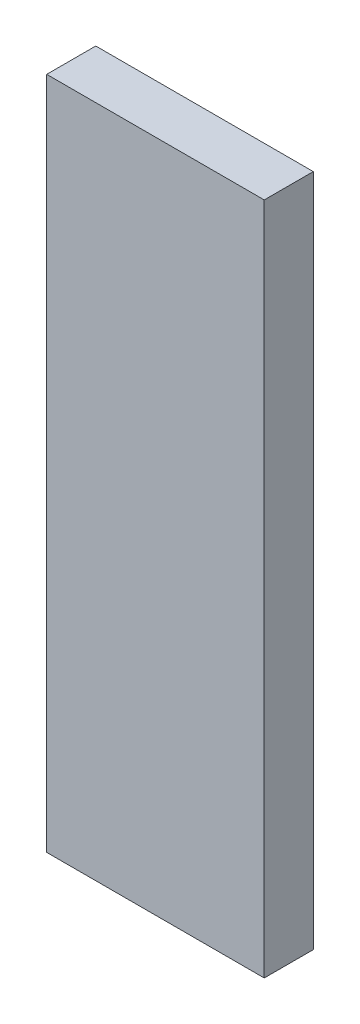
ISO-10303-21;
HEADER;
FILE_DESCRIPTION(('STEP AP214'),'2;1');
FILE_NAME('part.step','',(''),(''),'','','');
FILE_SCHEMA(('AUTOMOTIVE_DESIGN { 1 0 10303 214 1 1 1 1 }'));
ENDSEC;
DATA;
#1=APPLICATION_CONTEXT('core data for automotive mechanical design processes');
#2=APPLICATION_PROTOCOL_DEFINITION('international standard','automotive_design',2000,#1);
#3=PRODUCT_CONTEXT('',#1,'mechanical');
#4=PRODUCT('Part','Part','',(#3));
#5=PRODUCT_RELATED_PRODUCT_CATEGORY('part','',(#4));
#6=PRODUCT_DEFINITION_FORMATION('','',#4);
#7=PRODUCT_DEFINITION_CONTEXT('part definition',#1,'design');
#8=PRODUCT_DEFINITION('design','',#6,#7);
#9=PRODUCT_DEFINITION_SHAPE('','',#8);
#10=(LENGTH_UNIT() NAMED_UNIT(*) SI_UNIT(.MILLI.,.METRE.));
#11=(NAMED_UNIT(*) PLANE_ANGLE_UNIT() SI_UNIT($,.RADIAN.));
#12=(NAMED_UNIT(*) SI_UNIT($,.STERADIAN.) SOLID_ANGLE_UNIT());
#13=UNCERTAINTY_MEASURE_WITH_UNIT(LENGTH_MEASURE(1.E-05),#10,'distance_accuracy_value','');
#14=(GEOMETRIC_REPRESENTATION_CONTEXT(3) GLOBAL_UNCERTAINTY_ASSIGNED_CONTEXT((#13)) GLOBAL_UNIT_ASSIGNED_CONTEXT((#10,
#11,#12)) REPRESENTATION_CONTEXT('',''));
#15=CARTESIAN_POINT('',(0.,0.,0.));
#16=DIRECTION('',(0.,0.,1.));
#17=DIRECTION('',(1.,0.,0.));
#18=AXIS2_PLACEMENT_3D('',#15,#16,#17);
#19=CARTESIAN_POINT('',(-66.5,-206.,30.));
#20=DIRECTION('',(1.,0.,0.));
#21=DIRECTION('',(0.,0.,-1.));
#22=AXIS2_PLACEMENT_3D('',#19,#20,#21);
#23=PLANE('',#22);
#24=DIRECTION('',(0.,-1.,0.));
#25=VECTOR('',#24,1.);
#26=CARTESIAN_POINT('',(-66.5,-206.,0.));
#27=LINE('',#26,#25);
#28=CARTESIAN_POINT('',(-66.5,206.,0.));
#29=VERTEX_POINT('',#28);
#30=CARTESIAN_POINT('',(-66.5,-206.,0.));
#31=VERTEX_POINT('',#30);
#32=EDGE_CURVE('E98',#29,#31,#27,.T.);
#33=ORIENTED_EDGE('',*,*,#32,.T.);
#34=DIRECTION('',(0.,0.,-1.));
#35=VECTOR('',#34,1.);
#36=CARTESIAN_POINT('',(-66.5,-206.,30.));
#37=LINE('',#36,#35);
#38=CARTESIAN_POINT('',(-66.5,-206.,30.));
#39=VERTEX_POINT('',#38);
#40=EDGE_CURVE('E11',#39,#31,#37,.T.);
#41=ORIENTED_EDGE('',*,*,#40,.F.);
#42=DIRECTION('',(0.,-1.,0.));
#43=VECTOR('',#42,1.);
#44=CARTESIAN_POINT('',(-66.5,-206.,30.));
#45=LINE('',#44,#43);
#46=CARTESIAN_POINT('',(-66.5,206.,30.));
#47=VERTEX_POINT('',#46);
#48=EDGE_CURVE('E86',#47,#39,#45,.T.);
#49=ORIENTED_EDGE('',*,*,#48,.F.);
#50=DIRECTION('',(0.,0.,-1.));
#51=VECTOR('',#50,1.);
#52=CARTESIAN_POINT('',(-66.5,206.,30.));
#53=LINE('',#52,#51);
#54=EDGE_CURVE('E94',#47,#29,#53,.T.);
#55=ORIENTED_EDGE('',*,*,#54,.T.);
#56=EDGE_LOOP('',(#33,#41,#49,#55));
#57=FACE_BOUND('',#56,.T.);
#58=ADVANCED_FACE('F35',(#57),#23,.F.);
#59=CARTESIAN_POINT('',(66.5,-206.,30.));
#60=DIRECTION('',(0.,1.,0.));
#61=DIRECTION('',(0.,0.,1.));
#62=AXIS2_PLACEMENT_3D('',#59,#60,#61);
#63=PLANE('',#62);
#64=DIRECTION('',(1.,0.,0.));
#65=VECTOR('',#64,1.);
#66=CARTESIAN_POINT('',(66.5,-206.,0.));
#67=LINE('',#66,#65);
#68=CARTESIAN_POINT('',(66.5,-206.,0.));
#69=VERTEX_POINT('',#68);
#70=EDGE_CURVE('E90',#31,#69,#67,.T.);
#71=ORIENTED_EDGE('',*,*,#70,.T.);
#72=DIRECTION('',(0.,0.,-1.));
#73=VECTOR('',#72,1.);
#74=CARTESIAN_POINT('',(66.5,-206.,30.));
#75=LINE('',#74,#73);
#76=CARTESIAN_POINT('',(66.5,-206.,30.));
#77=VERTEX_POINT('',#76);
#78=EDGE_CURVE('E43',#77,#69,#75,.T.);
#79=ORIENTED_EDGE('',*,*,#78,.F.);
#80=DIRECTION('',(1.,0.,0.));
#81=VECTOR('',#80,1.);
#82=CARTESIAN_POINT('',(66.5,-206.,30.));
#83=LINE('',#82,#81);
#84=EDGE_CURVE('E81',#39,#77,#83,.T.);
#85=ORIENTED_EDGE('',*,*,#84,.F.);
#86=ORIENTED_EDGE('',*,*,#40,.T.);
#87=EDGE_LOOP('',(#71,#79,#85,#86));
#88=FACE_BOUND('',#87,.T.);
#89=ADVANCED_FACE('F89',(#88),#63,.F.);
#90=CARTESIAN_POINT('',(66.5,-206.,30.));
#91=DIRECTION('',(-1.,0.,0.));
#92=DIRECTION('',(0.,0.,1.));
#93=AXIS2_PLACEMENT_3D('',#90,#91,#92);
#94=PLANE('',#93);
#95=DIRECTION('',(0.,1.,0.));
#96=VECTOR('',#95,1.);
#97=CARTESIAN_POINT('',(66.5,-206.,0.));
#98=LINE('',#97,#96);
#99=CARTESIAN_POINT('',(66.5,206.,0.));
#100=VERTEX_POINT('',#99);
#101=EDGE_CURVE('E68',#69,#100,#98,.T.);
#102=ORIENTED_EDGE('',*,*,#101,.T.);
#103=DIRECTION('',(0.,0.,-1.));
#104=VECTOR('',#103,1.);
#105=CARTESIAN_POINT('',(66.5,206.,30.));
#106=LINE('',#105,#104);
#107=CARTESIAN_POINT('',(66.5,206.,30.));
#108=VERTEX_POINT('',#107);
#109=EDGE_CURVE('E91',#108,#100,#106,.T.);
#110=ORIENTED_EDGE('',*,*,#109,.F.);
#111=DIRECTION('',(0.,1.,0.));
#112=VECTOR('',#111,1.);
#113=CARTESIAN_POINT('',(66.5,-206.,30.));
#114=LINE('',#113,#112);
#115=EDGE_CURVE('E84',#77,#108,#114,.T.);
#116=ORIENTED_EDGE('',*,*,#115,.F.);
#117=ORIENTED_EDGE('',*,*,#78,.T.);
#118=EDGE_LOOP('',(#102,#110,#116,#117));
#119=FACE_BOUND('',#118,.T.);
#120=ADVANCED_FACE('F92',(#119),#94,.F.);
#121=CARTESIAN_POINT('',(66.5,206.,30.));
#122=DIRECTION('',(0.,-1.,0.));
#123=DIRECTION('',(0.,0.,-1.));
#124=AXIS2_PLACEMENT_3D('',#121,#122,#123);
#125=PLANE('',#124);
#126=DIRECTION('',(-1.,0.,0.));
#127=VECTOR('',#126,1.);
#128=CARTESIAN_POINT('',(66.5,206.,0.));
#129=LINE('',#128,#127);
#130=EDGE_CURVE('E74',#100,#29,#129,.T.);
#131=ORIENTED_EDGE('',*,*,#130,.T.);
#132=ORIENTED_EDGE('',*,*,#54,.F.);
#133=DIRECTION('',(-1.,0.,0.));
#134=VECTOR('',#133,1.);
#135=CARTESIAN_POINT('',(66.5,206.,30.));
#136=LINE('',#135,#134);
#137=EDGE_CURVE('E51',#108,#47,#136,.T.);
#138=ORIENTED_EDGE('',*,*,#137,.F.);
#139=ORIENTED_EDGE('',*,*,#109,.T.);
#140=EDGE_LOOP('',(#131,#132,#138,#139));
#141=FACE_BOUND('',#140,.T.);
#142=ADVANCED_FACE('F105',(#141),#125,.F.);
#143=CARTESIAN_POINT('',(0.,0.,30.));
#144=DIRECTION('',(0.,0.,1.));
#145=DIRECTION('',(1.,0.,0.));
#146=AXIS2_PLACEMENT_3D('',#143,#144,#145);
#147=PLANE('',#146);
#148=ORIENTED_EDGE('',*,*,#48,.T.);
#149=ORIENTED_EDGE('',*,*,#84,.T.);
#150=ORIENTED_EDGE('',*,*,#115,.T.);
#151=ORIENTED_EDGE('',*,*,#137,.T.);
#152=EDGE_LOOP('',(#148,#149,#150,#151));
#153=FACE_BOUND('',#152,.T.);
#154=ADVANCED_FACE('F82',(#153),#147,.T.);
#155=CARTESIAN_POINT('',(0.,0.,0.));
#156=DIRECTION('',(0.,0.,1.));
#157=DIRECTION('',(1.,0.,0.));
#158=AXIS2_PLACEMENT_3D('',#155,#156,#157);
#159=PLANE('',#158);
#160=ORIENTED_EDGE('',*,*,#32,.F.);
#161=ORIENTED_EDGE('',*,*,#130,.F.);
#162=ORIENTED_EDGE('',*,*,#101,.F.);
#163=ORIENTED_EDGE('',*,*,#70,.F.);
#164=EDGE_LOOP('',(#160,#161,#162,#163));
#165=FACE_BOUND('',#164,.T.);
#166=ADVANCED_FACE('F108',(#165),#159,.F.);
#167=CLOSED_SHELL('',(#58,#89,#120,#142,#154,#166));
#168=MANIFOLD_SOLID_BREP('B2',#167);
#169=ADVANCED_BREP_SHAPE_REPRESENTATION('',(#18,#168),#14);
#170=SHAPE_DEFINITION_REPRESENTATION(#9,#169);
ENDSEC;
END-ISO-10303-21;
